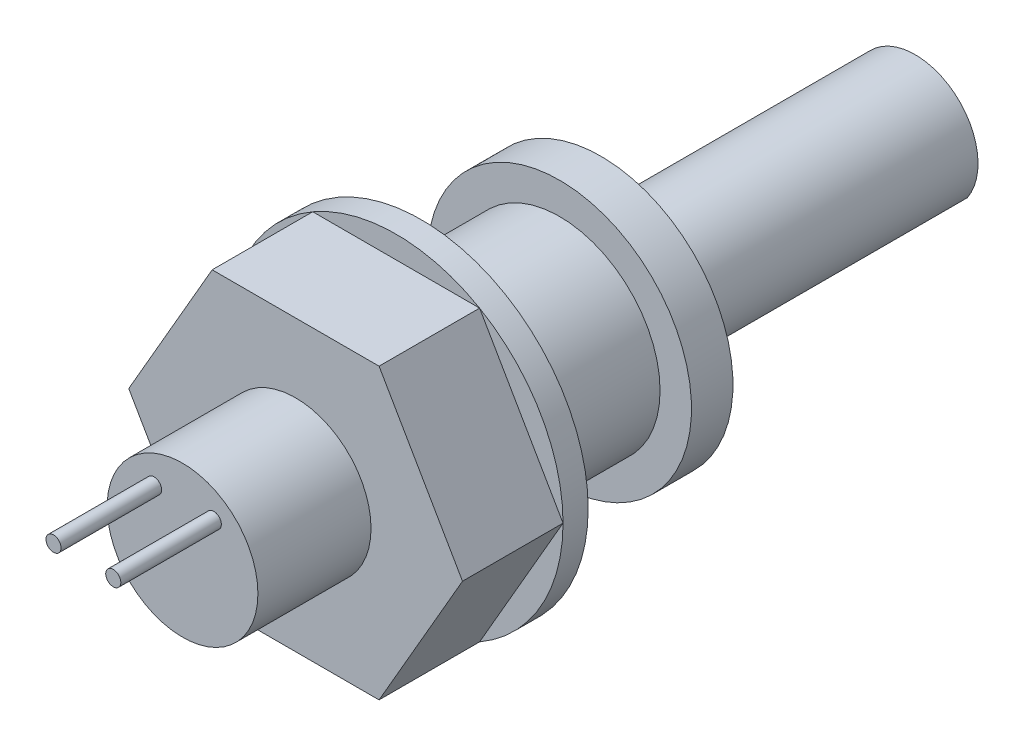
ISO-10303-21;
HEADER;
FILE_DESCRIPTION(('STEP AP214'),'2;1');
FILE_NAME('part.step','',(''),(''),'','','');
FILE_SCHEMA(('AUTOMOTIVE_DESIGN { 1 0 10303 214 1 1 1 1 }'));
ENDSEC;
DATA;
#1=APPLICATION_CONTEXT('core data for automotive mechanical design processes');
#2=APPLICATION_PROTOCOL_DEFINITION('international standard','automotive_design',2000,#1);
#3=PRODUCT_CONTEXT('',#1,'mechanical');
#4=PRODUCT('Part','Part','',(#3));
#5=PRODUCT_RELATED_PRODUCT_CATEGORY('part','',(#4));
#6=PRODUCT_DEFINITION_FORMATION('','',#4);
#7=PRODUCT_DEFINITION_CONTEXT('part definition',#1,'design');
#8=PRODUCT_DEFINITION('design','',#6,#7);
#9=PRODUCT_DEFINITION_SHAPE('','',#8);
#10=(LENGTH_UNIT() NAMED_UNIT(*) SI_UNIT(.MILLI.,.METRE.));
#11=(NAMED_UNIT(*) PLANE_ANGLE_UNIT() SI_UNIT($,.RADIAN.));
#12=(NAMED_UNIT(*) SI_UNIT($,.STERADIAN.) SOLID_ANGLE_UNIT());
#13=UNCERTAINTY_MEASURE_WITH_UNIT(LENGTH_MEASURE(1.E-05),#10,'distance_accuracy_value','');
#14=(GEOMETRIC_REPRESENTATION_CONTEXT(3) GLOBAL_UNCERTAINTY_ASSIGNED_CONTEXT((#13)) GLOBAL_UNIT_ASSIGNED_CONTEXT((#10,
#11,#12)) REPRESENTATION_CONTEXT('',''));
#15=CARTESIAN_POINT('',(0.,0.,0.));
#16=DIRECTION('',(0.,0.,1.));
#17=DIRECTION('',(1.,0.,0.));
#18=AXIS2_PLACEMENT_3D('',#15,#16,#17);
#19=CARTESIAN_POINT('',(0.,0.,-13.));
#20=DIRECTION('',(0.,0.,1.));
#21=DIRECTION('',(1.,0.,0.));
#22=AXIS2_PLACEMENT_3D('',#19,#20,#21);
#23=CYLINDRICAL_SURFACE('',#22,8.);
#24=CARTESIAN_POINT('',(0.,0.,-2.));
#25=DIRECTION('',(0.,0.,-1.));
#26=DIRECTION('',(-1.,0.,0.));
#27=AXIS2_PLACEMENT_3D('',#24,#25,#26);
#28=CIRCLE('',#27,8.);
#29=CARTESIAN_POINT('',(8.,0.,-2.));
#30=VERTEX_POINT('',#29);
#31=EDGE_CURVE('E42',#30,#30,#28,.T.);
#32=CARTESIAN_POINT('',(0.,0.,-13.));
#33=DIRECTION('',(0.,0.,-1.));
#34=DIRECTION('',(-1.,0.,0.));
#35=AXIS2_PLACEMENT_3D('',#32,#33,#34);
#36=CIRCLE('',#35,8.);
#37=CARTESIAN_POINT('',(8.,0.,-13.));
#38=VERTEX_POINT('',#37);
#39=EDGE_CURVE('E241',#38,#38,#36,.T.);
#40=CARTESIAN_POINT('',(8.,0.,-2.));
#41=CARTESIAN_POINT('',(8.,0.,-2.11458333333333));
#42=CARTESIAN_POINT('',(8.,0.,-2.22916666666667));
#43=CARTESIAN_POINT('',(8.,0.,-2.45833333333333));
#44=CARTESIAN_POINT('',(8.,0.,-2.57291666666667));
#45=CARTESIAN_POINT('',(8.,0.,-2.80208333333333));
#46=CARTESIAN_POINT('',(8.,0.,-2.91666666666667));
#47=CARTESIAN_POINT('',(8.,0.,-3.14583333333333));
#48=CARTESIAN_POINT('',(8.,0.,-3.26041666666666));
#49=CARTESIAN_POINT('',(8.,0.,-3.48958333333333));
#50=CARTESIAN_POINT('',(8.,0.,-3.60416666666666));
#51=CARTESIAN_POINT('',(8.,0.,-3.83333333333333));
#52=CARTESIAN_POINT('',(8.,0.,-3.94791666666666));
#53=CARTESIAN_POINT('',(8.,0.,-4.17708333333333));
#54=CARTESIAN_POINT('',(8.,0.,-4.29166666666667));
#55=CARTESIAN_POINT('',(8.,0.,-4.52083333333333));
#56=CARTESIAN_POINT('',(8.,0.,-4.63541666666667));
#57=CARTESIAN_POINT('',(8.,0.,-4.86458333333333));
#58=CARTESIAN_POINT('',(8.,0.,-4.97916666666666));
#59=CARTESIAN_POINT('',(8.,0.,-5.20833333333333));
#60=CARTESIAN_POINT('',(8.,0.,-5.32291666666666));
#61=CARTESIAN_POINT('',(8.,0.,-5.55208333333333));
#62=CARTESIAN_POINT('',(8.,0.,-5.66666666666666));
#63=CARTESIAN_POINT('',(8.,0.,-5.89583333333333));
#64=CARTESIAN_POINT('',(8.,0.,-6.01041666666666));
#65=CARTESIAN_POINT('',(8.,0.,-6.23958333333333));
#66=CARTESIAN_POINT('',(8.,0.,-6.35416666666666));
#67=CARTESIAN_POINT('',(8.,0.,-6.58333333333333));
#68=CARTESIAN_POINT('',(8.,0.,-6.69791666666666));
#69=CARTESIAN_POINT('',(8.,0.,-6.92708333333333));
#70=CARTESIAN_POINT('',(8.,0.,-7.04166666666667));
#71=CARTESIAN_POINT('',(8.,0.,-7.27083333333333));
#72=CARTESIAN_POINT('',(8.,0.,-7.38541666666666));
#73=CARTESIAN_POINT('',(8.,0.,-7.61458333333333));
#74=CARTESIAN_POINT('',(8.,0.,-7.72916666666666));
#75=CARTESIAN_POINT('',(8.,0.,-7.95833333333333));
#76=CARTESIAN_POINT('',(8.,0.,-8.07291666666666));
#77=CARTESIAN_POINT('',(8.,0.,-8.30208333333333));
#78=CARTESIAN_POINT('',(8.,0.,-8.41666666666666));
#79=CARTESIAN_POINT('',(8.,0.,-8.64583333333333));
#80=CARTESIAN_POINT('',(8.,0.,-8.76041666666666));
#81=CARTESIAN_POINT('',(8.,0.,-8.98958333333333));
#82=CARTESIAN_POINT('',(8.,0.,-9.10416666666666));
#83=CARTESIAN_POINT('',(8.,0.,-9.33333333333333));
#84=CARTESIAN_POINT('',(8.,0.,-9.44791666666667));
#85=CARTESIAN_POINT('',(8.,0.,-9.67708333333333));
#86=CARTESIAN_POINT('',(8.,0.,-9.79166666666666));
#87=CARTESIAN_POINT('',(8.,0.,-10.0208333333333));
#88=CARTESIAN_POINT('',(8.,0.,-10.1354166666667));
#89=CARTESIAN_POINT('',(8.,0.,-10.3645833333333));
#90=CARTESIAN_POINT('',(8.,0.,-10.4791666666667));
#91=CARTESIAN_POINT('',(8.,0.,-10.7083333333333));
#92=CARTESIAN_POINT('',(8.,0.,-10.8229166666667));
#93=CARTESIAN_POINT('',(8.,0.,-11.0520833333333));
#94=CARTESIAN_POINT('',(8.,0.,-11.1666666666667));
#95=CARTESIAN_POINT('',(8.,0.,-11.3958333333333));
#96=CARTESIAN_POINT('',(8.,0.,-11.5104166666667));
#97=CARTESIAN_POINT('',(8.,0.,-11.7395833333333));
#98=CARTESIAN_POINT('',(8.,0.,-11.8541666666667));
#99=CARTESIAN_POINT('',(8.,0.,-12.0833333333333));
#100=CARTESIAN_POINT('',(8.,0.,-12.1979166666667));
#101=CARTESIAN_POINT('',(8.,0.,-12.4270833333333));
#102=CARTESIAN_POINT('',(8.,0.,-12.5416666666667));
#103=CARTESIAN_POINT('',(8.,0.,-12.7708333333333));
#104=CARTESIAN_POINT('',(8.,0.,-12.8854166666667));
#105=CARTESIAN_POINT('',(8.,0.,-13.));
#106=B_SPLINE_CURVE_WITH_KNOTS('',3,(#40,#41,#42,#43,#44,#45,#46,#47,#48,#49,#50,#51,#52,#53,
#54,#55,#56,#57,#58,#59,#60,#61,#62,#63,#64,#65,#66,#67,#68,#69,#70,#71,#72,#73,#74,#75,#76,#77,
#78,#79,#80,#81,#82,#83,#84,#85,#86,#87,#88,#89,#90,#91,#92,#93,#94,#95,#96,#97,#98,#99,#100,
#101,#102,#103,#104,#105),.UNSPECIFIED.,.F.,.F.,(4,2,2,2,2,2,2,2,2,2,2,2,2,2,2,2,2,2,2,2,2,2,2,
2,2,2,2,2,2,2,2,2,4),(0.,0.34375,0.687500000000001,1.03125,1.375,1.71875,2.0625,2.40625,2.75,
3.09375,3.4375,3.78125,4.125,4.46875,4.8125,5.15625,5.5,5.84375,6.1875,6.53125,6.875,7.21875,
7.5625,7.90625,8.25,8.59375,8.9375,9.28125,9.625,9.96875,10.3125,10.65625,11.),.UNSPECIFIED.);
#107=EDGE_CURVE('BSEAM38',#30,#38,#106,.T.);
#108=ORIENTED_EDGE('',*,*,#31,.T.);
#109=ORIENTED_EDGE('',*,*,#39,.F.);
#110=ORIENTED_EDGE('',*,*,#107,.T.);
#111=ORIENTED_EDGE('',*,*,#107,.F.);
#112=EDGE_LOOP('',(#108,#110,#109,#111));
#113=FACE_BOUND('',#112,.T.);
#114=ADVANCED_FACE('F38',(#113),#23,.T.);
#115=CARTESIAN_POINT('',(0.,0.,-16.3));
#116=DIRECTION('',(0.,0.,1.));
#117=DIRECTION('',(1.,0.,0.));
#118=AXIS2_PLACEMENT_3D('',#115,#116,#117);
#119=CYLINDRICAL_SURFACE('',#118,10.5);
#120=CARTESIAN_POINT('',(0.,0.,-16.3));
#121=DIRECTION('',(0.,0.,-1.));
#122=DIRECTION('',(-1.,0.,0.));
#123=AXIS2_PLACEMENT_3D('',#120,#121,#122);
#124=CIRCLE('',#123,10.5);
#125=CARTESIAN_POINT('',(-10.5,0.,-16.3));
#126=VERTEX_POINT('',#125);
#127=EDGE_CURVE('E238',#126,#126,#124,.T.);
#128=ORIENTED_EDGE('',*,*,#127,.F.);
#129=EDGE_LOOP('',(#128));
#130=FACE_BOUND('',#129,.T.);
#131=CARTESIAN_POINT('',(0.,0.,-13.));
#132=DIRECTION('',(0.,0.,-1.));
#133=DIRECTION('',(-1.,0.,0.));
#134=AXIS2_PLACEMENT_3D('',#131,#132,#133);
#135=CIRCLE('',#134,10.5);
#136=CARTESIAN_POINT('',(-10.5,0.,-13.));
#137=VERTEX_POINT('',#136);
#138=EDGE_CURVE('E237',#137,#137,#135,.T.);
#139=ORIENTED_EDGE('',*,*,#138,.T.);
#140=EDGE_LOOP('',(#139));
#141=FACE_BOUND('',#140,.T.);
#142=ADVANCED_FACE('F298',(#130,#141),#119,.T.);
#143=CARTESIAN_POINT('',(0.,0.,-16.3));
#144=DIRECTION('',(0.,0.,-1.));
#145=DIRECTION('',(-1.,0.,0.));
#146=AXIS2_PLACEMENT_3D('',#143,#144,#145);
#147=PLANE('',#146);
#148=CARTESIAN_POINT('',(0.,0.,-16.3));
#149=DIRECTION('',(0.,0.,-1.));
#150=DIRECTION('',(-1.,0.,0.));
#151=AXIS2_PLACEMENT_3D('',#148,#149,#150);
#152=CIRCLE('',#151,5.);
#153=CARTESIAN_POINT('',(-4.1480961905584,-2.79164789933739,-16.3));
#154=VERTEX_POINT('',#153);
#155=CARTESIAN_POINT('',(4.1480961905584,-2.79164789933739,-16.3));
#156=VERTEX_POINT('',#155);
#157=EDGE_CURVE('E226',#154,#156,#152,.T.);
#158=ORIENTED_EDGE('',*,*,#157,.F.);
#159=DIRECTION('',(-1.,0.,0.));
#160=VECTOR('',#159,1.);
#161=CARTESIAN_POINT('',(4.1480961905584,-2.79164789933739,-16.3));
#162=LINE('',#161,#160);
#163=EDGE_CURVE('E55',#156,#154,#162,.T.);
#164=ORIENTED_EDGE('',*,*,#163,.F.);
#165=EDGE_LOOP('',(#158,#164));
#166=FACE_BOUND('',#165,.T.);
#167=ORIENTED_EDGE('',*,*,#127,.T.);
#168=EDGE_LOOP('',(#167));
#169=FACE_BOUND('',#168,.T.);
#170=ADVANCED_FACE('F304',(#166,#169),#147,.T.);
#171=CARTESIAN_POINT('',(0.,0.,-13.));
#172=DIRECTION('',(0.,0.,-1.));
#173=DIRECTION('',(-1.,0.,0.));
#174=AXIS2_PLACEMENT_3D('',#171,#172,#173);
#175=PLANE('',#174);
#176=ORIENTED_EDGE('',*,*,#39,.T.);
#177=EDGE_LOOP('',(#176));
#178=FACE_BOUND('',#177,.T.);
#179=ORIENTED_EDGE('',*,*,#138,.F.);
#180=EDGE_LOOP('',(#179));
#181=FACE_BOUND('',#180,.T.);
#182=ADVANCED_FACE('F310',(#178,#181),#175,.F.);
#183=CARTESIAN_POINT('',(0.,0.,-41.3));
#184=DIRECTION('',(0.,0.,1.));
#185=DIRECTION('',(1.,0.,0.));
#186=AXIS2_PLACEMENT_3D('',#183,#184,#185);
#187=CYLINDRICAL_SURFACE('',#186,5.);
#188=ORIENTED_EDGE('',*,*,#157,.T.);
#189=DIRECTION('',(0.,0.,1.));
#190=VECTOR('',#189,1.);
#191=CARTESIAN_POINT('',(4.1480961905584,-2.79164789933739,-41.3));
#192=LINE('',#191,#190);
#193=CARTESIAN_POINT('',(4.1480961905584,-2.79164789933739,-41.3));
#194=VERTEX_POINT('',#193);
#195=EDGE_CURVE('E234',#194,#156,#192,.T.);
#196=ORIENTED_EDGE('',*,*,#195,.F.);
#197=CARTESIAN_POINT('',(0.,0.,-41.3));
#198=DIRECTION('',(0.,0.,-1.));
#199=DIRECTION('',(-1.,0.,0.));
#200=AXIS2_PLACEMENT_3D('',#197,#198,#199);
#201=CIRCLE('',#200,5.);
#202=CARTESIAN_POINT('',(-4.1480961905584,-2.79164789933739,-41.3));
#203=VERTEX_POINT('',#202);
#204=EDGE_CURVE('E220',#203,#194,#201,.T.);
#205=ORIENTED_EDGE('',*,*,#204,.F.);
#206=DIRECTION('',(0.,0.,1.));
#207=VECTOR('',#206,1.);
#208=CARTESIAN_POINT('',(-4.1480961905584,-2.79164789933739,-41.3));
#209=LINE('',#208,#207);
#210=EDGE_CURVE('E225',#203,#154,#209,.T.);
#211=ORIENTED_EDGE('',*,*,#210,.T.);
#212=EDGE_LOOP('',(#188,#196,#205,#211));
#213=FACE_BOUND('',#212,.T.);
#214=ADVANCED_FACE('F313',(#213),#187,.T.);
#215=CARTESIAN_POINT('',(4.1480961905584,-2.79164789933739,-41.3));
#216=DIRECTION('',(0.,1.,0.));
#217=DIRECTION('',(-1.,0.,0.));
#218=AXIS2_PLACEMENT_3D('',#215,#216,#217);
#219=PLANE('',#218);
#220=ORIENTED_EDGE('',*,*,#163,.T.);
#221=ORIENTED_EDGE('',*,*,#210,.F.);
#222=DIRECTION('',(-1.,0.,0.));
#223=VECTOR('',#222,1.);
#224=CARTESIAN_POINT('',(4.1480961905584,-2.79164789933739,-41.3));
#225=LINE('',#224,#223);
#226=EDGE_CURVE('E88',#194,#203,#225,.T.);
#227=ORIENTED_EDGE('',*,*,#226,.F.);
#228=ORIENTED_EDGE('',*,*,#195,.T.);
#229=EDGE_LOOP('',(#220,#221,#227,#228));
#230=FACE_BOUND('',#229,.T.);
#231=ADVANCED_FACE('F319',(#230),#219,.F.);
#232=CARTESIAN_POINT('',(0.,0.,-41.3));
#233=DIRECTION('',(0.,0.,-1.));
#234=DIRECTION('',(-1.,0.,0.));
#235=AXIS2_PLACEMENT_3D('',#232,#233,#234);
#236=PLANE('',#235);
#237=ORIENTED_EDGE('',*,*,#204,.T.);
#238=ORIENTED_EDGE('',*,*,#226,.T.);
#239=EDGE_LOOP('',(#237,#238));
#240=FACE_BOUND('',#239,.T.);
#241=ADVANCED_FACE('F323',(#240),#236,.T.);
#242=CARTESIAN_POINT('',(0.,0.,0.));
#243=DIRECTION('',(0.,0.,-1.));
#244=DIRECTION('',(-1.,0.,0.));
#245=AXIS2_PLACEMENT_3D('',#242,#243,#244);
#246=PLANE('',#245);
#247=CARTESIAN_POINT('',(0.,0.,0.));
#248=DIRECTION('',(0.,0.,-1.));
#249=DIRECTION('',(-1.,0.,0.));
#250=AXIS2_PLACEMENT_3D('',#247,#248,#249);
#251=CIRCLE('',#250,13.2790561913614);
#252=CARTESIAN_POINT('',(6.63952809568069,-11.5,0.));
#253=VERTEX_POINT('',#252);
#254=CARTESIAN_POINT('',(-6.6395280956807,-11.5,0.));
#255=VERTEX_POINT('',#254);
#256=EDGE_CURVE('E77',#253,#255,#251,.T.);
#257=ORIENTED_EDGE('',*,*,#256,.F.);
#258=DIRECTION('',(1.,0.,0.));
#259=VECTOR('',#258,1.);
#260=CARTESIAN_POINT('',(-6.6395280956807,-11.5,0.));
#261=LINE('',#260,#259);
#262=EDGE_CURVE('E139',#255,#253,#261,.T.);
#263=ORIENTED_EDGE('',*,*,#262,.F.);
#264=EDGE_LOOP('',(#257,#263));
#265=FACE_BOUND('',#264,.T.);
#266=ADVANCED_FACE('F187',(#265),#246,.F.);
#267=CARTESIAN_POINT('',(13.2790561913614,0.,0.));
#268=VERTEX_POINT('',#267);
#269=EDGE_CURVE('E558',#268,#253,#251,.T.);
#270=ORIENTED_EDGE('',*,*,#269,.F.);
#271=DIRECTION('',(0.5,0.866025403784439,0.));
#272=VECTOR('',#271,1.);
#273=CARTESIAN_POINT('',(6.63952809568069,-11.5,0.));
#274=LINE('',#273,#272);
#275=EDGE_CURVE('E143',#253,#268,#274,.T.);
#276=ORIENTED_EDGE('',*,*,#275,.F.);
#277=EDGE_LOOP('',(#270,#276));
#278=FACE_BOUND('',#277,.T.);
#279=ADVANCED_FACE('F434',(#278),#246,.F.);
#280=CARTESIAN_POINT('',(6.6395280956807,11.5,0.));
#281=VERTEX_POINT('',#280);
#282=EDGE_CURVE('E217',#281,#268,#251,.T.);
#283=ORIENTED_EDGE('',*,*,#282,.F.);
#284=DIRECTION('',(-0.5,0.866025403784439,0.));
#285=VECTOR('',#284,1.);
#286=CARTESIAN_POINT('',(13.2790561913614,0.,0.));
#287=LINE('',#286,#285);
#288=EDGE_CURVE('E148',#268,#281,#287,.T.);
#289=ORIENTED_EDGE('',*,*,#288,.F.);
#290=EDGE_LOOP('',(#283,#289));
#291=FACE_BOUND('',#290,.T.);
#292=ADVANCED_FACE('F426',(#291),#246,.F.);
#293=CARTESIAN_POINT('',(-6.6395280956807,11.5,0.));
#294=VERTEX_POINT('',#293);
#295=EDGE_CURVE('E210',#294,#281,#251,.T.);
#296=ORIENTED_EDGE('',*,*,#295,.F.);
#297=DIRECTION('',(-1.,0.,0.));
#298=VECTOR('',#297,1.);
#299=CARTESIAN_POINT('',(6.6395280956807,11.5,0.));
#300=LINE('',#299,#298);
#301=EDGE_CURVE('E121',#281,#294,#300,.T.);
#302=ORIENTED_EDGE('',*,*,#301,.F.);
#303=EDGE_LOOP('',(#296,#302));
#304=FACE_BOUND('',#303,.T.);
#305=ADVANCED_FACE('F419',(#304),#246,.F.);
#306=CARTESIAN_POINT('',(-13.2790561913614,0.,0.));
#307=VERTEX_POINT('',#306);
#308=EDGE_CURVE('E200',#307,#294,#251,.T.);
#309=ORIENTED_EDGE('',*,*,#308,.F.);
#310=DIRECTION('',(-0.5,-0.866025403784439,0.));
#311=VECTOR('',#310,1.);
#312=CARTESIAN_POINT('',(-6.6395280956807,11.5,0.));
#313=LINE('',#312,#311);
#314=EDGE_CURVE('E154',#294,#307,#313,.T.);
#315=ORIENTED_EDGE('',*,*,#314,.F.);
#316=EDGE_LOOP('',(#309,#315));
#317=FACE_BOUND('',#316,.T.);
#318=ADVANCED_FACE('F206',(#317),#246,.F.);
#319=CARTESIAN_POINT('',(0.,0.,-2.));
#320=DIRECTION('',(0.,0.,1.));
#321=DIRECTION('',(1.,0.,0.));
#322=AXIS2_PLACEMENT_3D('',#319,#320,#321);
#323=CYLINDRICAL_SURFACE('',#322,13.2790561913614);
#324=CARTESIAN_POINT('',(0.,0.,-2.));
#325=DIRECTION('',(0.,0.,-1.));
#326=DIRECTION('',(-1.,0.,0.));
#327=AXIS2_PLACEMENT_3D('',#324,#325,#326);
#328=CIRCLE('',#327,13.2790561913614);
#329=CARTESIAN_POINT('',(-13.2790561913614,0.,-2.));
#330=VERTEX_POINT('',#329);
#331=EDGE_CURVE('E209',#330,#330,#328,.T.);
#332=ORIENTED_EDGE('',*,*,#331,.F.);
#333=EDGE_LOOP('',(#332));
#334=FACE_BOUND('',#333,.T.);
#335=ORIENTED_EDGE('',*,*,#308,.T.);
#336=ORIENTED_EDGE('',*,*,#295,.T.);
#337=ORIENTED_EDGE('',*,*,#282,.T.);
#338=ORIENTED_EDGE('',*,*,#269,.T.);
#339=ORIENTED_EDGE('',*,*,#256,.T.);
#340=EDGE_CURVE('E194',#255,#307,#251,.T.);
#341=ORIENTED_EDGE('',*,*,#340,.T.);
#342=EDGE_LOOP('',(#335,#336,#337,#338,#339,#341));
#343=FACE_BOUND('',#342,.T.);
#344=ADVANCED_FACE('F198',(#334,#343),#323,.T.);
#345=CARTESIAN_POINT('',(0.,0.,-2.));
#346=DIRECTION('',(0.,0.,-1.));
#347=DIRECTION('',(-1.,0.,0.));
#348=AXIS2_PLACEMENT_3D('',#345,#346,#347);
#349=PLANE('',#348);
#350=ORIENTED_EDGE('',*,*,#31,.F.);
#351=EDGE_LOOP('',(#350));
#352=FACE_BOUND('',#351,.T.);
#353=ORIENTED_EDGE('',*,*,#331,.T.);
#354=EDGE_LOOP('',(#353));
#355=FACE_BOUND('',#354,.T.);
#356=ADVANCED_FACE('F329',(#352,#355),#349,.T.);
#357=ORIENTED_EDGE('',*,*,#340,.F.);
#358=DIRECTION('',(0.5,-0.866025403784439,0.));
#359=VECTOR('',#358,1.);
#360=CARTESIAN_POINT('',(-13.2790561913614,0.,0.));
#361=LINE('',#360,#359);
#362=EDGE_CURVE('E157',#307,#255,#361,.T.);
#363=ORIENTED_EDGE('',*,*,#362,.F.);
#364=EDGE_LOOP('',(#357,#363));
#365=FACE_BOUND('',#364,.T.);
#366=ADVANCED_FACE('F193',(#365),#246,.F.);
#367=CARTESIAN_POINT('',(0.,0.,17.));
#368=DIRECTION('',(0.,0.,1.));
#369=DIRECTION('',(1.,0.,0.));
#370=AXIS2_PLACEMENT_3D('',#367,#368,#369);
#371=PLANE('',#370);
#372=CARTESIAN_POINT('',(2.49018716204631,3.32024954939522,17.));
#373=DIRECTION('',(0.,0.,1.));
#374=DIRECTION('',(1.,0.,0.));
#375=AXIS2_PLACEMENT_3D('',#372,#373,#374);
#376=CIRCLE('',#375,0.6);
#377=CARTESIAN_POINT('',(3.09018716204631,3.32024954939522,17.));
#378=VERTEX_POINT('',#377);
#379=EDGE_CURVE('E257',#378,#378,#376,.T.);
#380=ORIENTED_EDGE('',*,*,#379,.F.);
#381=EDGE_LOOP('',(#380));
#382=FACE_BOUND('',#381,.T.);
#383=CARTESIAN_POINT('',(-2.26380651095119,3.32024954939522,17.));
#384=DIRECTION('',(0.,0.,1.));
#385=DIRECTION('',(1.,0.,0.));
#386=AXIS2_PLACEMENT_3D('',#383,#384,#385);
#387=CIRCLE('',#386,0.6);
#388=CARTESIAN_POINT('',(-1.66380651095119,3.32024954939522,17.));
#389=VERTEX_POINT('',#388);
#390=EDGE_CURVE('E256',#389,#389,#387,.T.);
#391=ORIENTED_EDGE('',*,*,#390,.F.);
#392=EDGE_LOOP('',(#391));
#393=FACE_BOUND('',#392,.T.);
#394=CARTESIAN_POINT('',(0.,0.,17.));
#395=DIRECTION('',(0.,0.,1.));
#396=DIRECTION('',(1.,0.,0.));
#397=AXIS2_PLACEMENT_3D('',#394,#395,#396);
#398=CIRCLE('',#397,6.);
#399=CARTESIAN_POINT('',(6.,0.,17.));
#400=VERTEX_POINT('',#399);
#401=EDGE_CURVE('E144',#400,#400,#398,.T.);
#402=ORIENTED_EDGE('',*,*,#401,.T.);
#403=EDGE_LOOP('',(#402));
#404=FACE_BOUND('',#403,.T.);
#405=ADVANCED_FACE('F278',(#382,#393,#404),#371,.T.);
#406=CARTESIAN_POINT('',(0.,0.,17.));
#407=DIRECTION('',(0.,0.,-1.));
#408=DIRECTION('',(-1.,0.,0.));
#409=AXIS2_PLACEMENT_3D('',#406,#407,#408);
#410=CYLINDRICAL_SURFACE('',#409,6.);
#411=ORIENTED_EDGE('',*,*,#401,.F.);
#412=EDGE_LOOP('',(#411));
#413=FACE_BOUND('',#412,.T.);
#414=CARTESIAN_POINT('',(0.,0.,8.));
#415=DIRECTION('',(0.,0.,1.));
#416=DIRECTION('',(1.,0.,0.));
#417=AXIS2_PLACEMENT_3D('',#414,#415,#416);
#418=CIRCLE('',#417,6.);
#419=CARTESIAN_POINT('',(6.,0.,8.));
#420=VERTEX_POINT('',#419);
#421=EDGE_CURVE('E11',#420,#420,#418,.T.);
#422=ORIENTED_EDGE('',*,*,#421,.T.);
#423=EDGE_LOOP('',(#422));
#424=FACE_BOUND('',#423,.T.);
#425=ADVANCED_FACE('F281',(#413,#424),#410,.T.);
#426=CARTESIAN_POINT('',(0.,0.,8.));
#427=DIRECTION('',(0.,0.,1.));
#428=DIRECTION('',(1.,0.,0.));
#429=AXIS2_PLACEMENT_3D('',#426,#427,#428);
#430=PLANE('',#429);
#431=ORIENTED_EDGE('',*,*,#421,.F.);
#432=EDGE_LOOP('',(#431));
#433=FACE_BOUND('',#432,.T.);
#434=DIRECTION('',(1.,0.,0.));
#435=VECTOR('',#434,1.);
#436=CARTESIAN_POINT('',(-6.6395280956807,-11.5,8.));
#437=LINE('',#436,#435);
#438=CARTESIAN_POINT('',(-6.6395280956807,-11.5,8.));
#439=VERTEX_POINT('',#438);
#440=CARTESIAN_POINT('',(6.63952809568069,-11.5,8.));
#441=VERTEX_POINT('',#440);
#442=EDGE_CURVE('E161',#439,#441,#437,.T.);
#443=ORIENTED_EDGE('',*,*,#442,.T.);
#444=DIRECTION('',(0.5,0.866025403784439,0.));
#445=VECTOR('',#444,1.);
#446=CARTESIAN_POINT('',(6.63952809568069,-11.5,8.));
#447=LINE('',#446,#445);
#448=CARTESIAN_POINT('',(13.2790561913614,0.,8.));
#449=VERTEX_POINT('',#448);
#450=EDGE_CURVE('E182',#441,#449,#447,.T.);
#451=ORIENTED_EDGE('',*,*,#450,.T.);
#452=DIRECTION('',(-0.5,0.866025403784439,0.));
#453=VECTOR('',#452,1.);
#454=CARTESIAN_POINT('',(13.2790561913614,0.,8.));
#455=LINE('',#454,#453);
#456=CARTESIAN_POINT('',(6.6395280956807,11.5,8.));
#457=VERTEX_POINT('',#456);
#458=EDGE_CURVE('E109',#449,#457,#455,.T.);
#459=ORIENTED_EDGE('',*,*,#458,.T.);
#460=DIRECTION('',(-1.,0.,0.));
#461=VECTOR('',#460,1.);
#462=CARTESIAN_POINT('',(6.6395280956807,11.5,8.));
#463=LINE('',#462,#461);
#464=CARTESIAN_POINT('',(-6.6395280956807,11.5,8.));
#465=VERTEX_POINT('',#464);
#466=EDGE_CURVE('E102',#457,#465,#463,.T.);
#467=ORIENTED_EDGE('',*,*,#466,.T.);
#468=DIRECTION('',(-0.5,-0.866025403784439,0.));
#469=VECTOR('',#468,1.);
#470=CARTESIAN_POINT('',(-6.6395280956807,11.5,8.));
#471=LINE('',#470,#469);
#472=CARTESIAN_POINT('',(-13.2790561913614,0.,8.));
#473=VERTEX_POINT('',#472);
#474=EDGE_CURVE('E106',#465,#473,#471,.T.);
#475=ORIENTED_EDGE('',*,*,#474,.T.);
#476=DIRECTION('',(0.5,-0.866025403784439,0.));
#477=VECTOR('',#476,1.);
#478=CARTESIAN_POINT('',(-13.2790561913614,0.,8.));
#479=LINE('',#478,#477);
#480=EDGE_CURVE('E64',#473,#439,#479,.T.);
#481=ORIENTED_EDGE('',*,*,#480,.T.);
#482=EDGE_LOOP('',(#443,#451,#459,#467,#475,#481));
#483=FACE_BOUND('',#482,.T.);
#484=ADVANCED_FACE('F104',(#433,#483),#430,.T.);
#485=CARTESIAN_POINT('',(-13.2790561913614,0.,8.));
#486=DIRECTION('',(0.866025403784439,0.5,0.));
#487=DIRECTION('',(-0.5,0.866025403784439,0.));
#488=AXIS2_PLACEMENT_3D('',#485,#486,#487);
#489=PLANE('',#488);
#490=ORIENTED_EDGE('',*,*,#362,.T.);
#491=DIRECTION('',(0.,0.,-1.));
#492=VECTOR('',#491,1.);
#493=CARTESIAN_POINT('',(-6.6395280956807,-11.5,8.));
#494=LINE('',#493,#492);
#495=EDGE_CURVE('E135',#439,#255,#494,.T.);
#496=ORIENTED_EDGE('',*,*,#495,.F.);
#497=ORIENTED_EDGE('',*,*,#480,.F.);
#498=DIRECTION('',(0.,0.,-1.));
#499=VECTOR('',#498,1.);
#500=CARTESIAN_POINT('',(-13.2790561913614,0.,8.));
#501=LINE('',#500,#499);
#502=EDGE_CURVE('E126',#473,#307,#501,.T.);
#503=ORIENTED_EDGE('',*,*,#502,.T.);
#504=EDGE_LOOP('',(#490,#496,#497,#503));
#505=FACE_BOUND('',#504,.T.);
#506=ADVANCED_FACE('F190',(#505),#489,.F.);
#507=CARTESIAN_POINT('',(-6.6395280956807,11.5,8.));
#508=DIRECTION('',(0.866025403784438,-0.5,0.));
#509=DIRECTION('',(0.5,0.866025403784439,0.));
#510=AXIS2_PLACEMENT_3D('',#507,#508,#509);
#511=PLANE('',#510);
#512=ORIENTED_EDGE('',*,*,#314,.T.);
#513=ORIENTED_EDGE('',*,*,#502,.F.);
#514=ORIENTED_EDGE('',*,*,#474,.F.);
#515=DIRECTION('',(0.,0.,-1.));
#516=VECTOR('',#515,1.);
#517=CARTESIAN_POINT('',(-6.6395280956807,11.5,8.));
#518=LINE('',#517,#516);
#519=EDGE_CURVE('E117',#465,#294,#518,.T.);
#520=ORIENTED_EDGE('',*,*,#519,.T.);
#521=EDGE_LOOP('',(#512,#513,#514,#520));
#522=FACE_BOUND('',#521,.T.);
#523=ADVANCED_FACE('F128',(#522),#511,.F.);
#524=CARTESIAN_POINT('',(6.6395280956807,11.5,8.));
#525=DIRECTION('',(0.,-1.,0.));
#526=DIRECTION('',(1.,0.,0.));
#527=AXIS2_PLACEMENT_3D('',#524,#525,#526);
#528=PLANE('',#527);
#529=ORIENTED_EDGE('',*,*,#301,.T.);
#530=ORIENTED_EDGE('',*,*,#519,.F.);
#531=ORIENTED_EDGE('',*,*,#466,.F.);
#532=DIRECTION('',(0.,0.,-1.));
#533=VECTOR('',#532,1.);
#534=CARTESIAN_POINT('',(6.6395280956807,11.5,8.));
#535=LINE('',#534,#533);
#536=EDGE_CURVE('E125',#457,#281,#535,.T.);
#537=ORIENTED_EDGE('',*,*,#536,.T.);
#538=EDGE_LOOP('',(#529,#530,#531,#537));
#539=FACE_BOUND('',#538,.T.);
#540=ADVANCED_FACE('F118',(#539),#528,.F.);
#541=CARTESIAN_POINT('',(13.2790561913614,0.,8.));
#542=DIRECTION('',(-0.866025403784439,-0.5,0.));
#543=DIRECTION('',(0.5,-0.866025403784439,0.));
#544=AXIS2_PLACEMENT_3D('',#541,#542,#543);
#545=PLANE('',#544);
#546=ORIENTED_EDGE('',*,*,#288,.T.);
#547=ORIENTED_EDGE('',*,*,#536,.F.);
#548=ORIENTED_EDGE('',*,*,#458,.F.);
#549=DIRECTION('',(0.,0.,-1.));
#550=VECTOR('',#549,1.);
#551=CARTESIAN_POINT('',(13.2790561913614,0.,8.));
#552=LINE('',#551,#550);
#553=EDGE_CURVE('E169',#449,#268,#552,.T.);
#554=ORIENTED_EDGE('',*,*,#553,.T.);
#555=EDGE_LOOP('',(#546,#547,#548,#554));
#556=FACE_BOUND('',#555,.T.);
#557=ADVANCED_FACE('F364',(#556),#545,.F.);
#558=CARTESIAN_POINT('',(6.63952809568069,-11.5,8.));
#559=DIRECTION('',(-0.866025403784439,0.5,0.));
#560=DIRECTION('',(-0.5,-0.866025403784439,0.));
#561=AXIS2_PLACEMENT_3D('',#558,#559,#560);
#562=PLANE('',#561);
#563=ORIENTED_EDGE('',*,*,#275,.T.);
#564=ORIENTED_EDGE('',*,*,#553,.F.);
#565=ORIENTED_EDGE('',*,*,#450,.F.);
#566=DIRECTION('',(0.,0.,-1.));
#567=VECTOR('',#566,1.);
#568=CARTESIAN_POINT('',(6.63952809568069,-11.5,8.));
#569=LINE('',#568,#567);
#570=EDGE_CURVE('E48',#441,#253,#569,.T.);
#571=ORIENTED_EDGE('',*,*,#570,.T.);
#572=EDGE_LOOP('',(#563,#564,#565,#571));
#573=FACE_BOUND('',#572,.T.);
#574=ADVANCED_FACE('F178',(#573),#562,.F.);
#575=CARTESIAN_POINT('',(-6.6395280956807,-11.5,8.));
#576=DIRECTION('',(0.,1.,0.));
#577=DIRECTION('',(0.,0.,1.));
#578=AXIS2_PLACEMENT_3D('',#575,#576,#577);
#579=PLANE('',#578);
#580=ORIENTED_EDGE('',*,*,#262,.T.);
#581=ORIENTED_EDGE('',*,*,#570,.F.);
#582=ORIENTED_EDGE('',*,*,#442,.F.);
#583=ORIENTED_EDGE('',*,*,#495,.T.);
#584=EDGE_LOOP('',(#580,#581,#582,#583));
#585=FACE_BOUND('',#584,.T.);
#586=ADVANCED_FACE('F40',(#585),#579,.F.);
#587=CARTESIAN_POINT('',(-2.26380651095119,3.32024954939522,25.));
#588=DIRECTION('',(0.,0.,-1.));
#589=DIRECTION('',(-1.,0.,0.));
#590=AXIS2_PLACEMENT_3D('',#587,#588,#589);
#591=CYLINDRICAL_SURFACE('',#590,0.6);
#592=CARTESIAN_POINT('',(-2.26380651095119,3.32024954939522,25.));
#593=DIRECTION('',(0.,0.,1.));
#594=DIRECTION('',(1.,0.,0.));
#595=AXIS2_PLACEMENT_3D('',#592,#593,#594);
#596=CIRCLE('',#595,0.6);
#597=CARTESIAN_POINT('',(-1.66380651095119,3.32024954939522,25.));
#598=VERTEX_POINT('',#597);
#599=EDGE_CURVE('E202',#598,#598,#596,.T.);
#600=ORIENTED_EDGE('',*,*,#599,.F.);
#601=EDGE_LOOP('',(#600));
#602=FACE_BOUND('',#601,.T.);
#603=ORIENTED_EDGE('',*,*,#390,.T.);
#604=EDGE_LOOP('',(#603));
#605=FACE_BOUND('',#604,.T.);
#606=ADVANCED_FACE('F272',(#602,#605),#591,.T.);
#607=CARTESIAN_POINT('',(-2.26380651095119,3.32024954939522,25.));
#608=DIRECTION('',(0.,0.,1.));
#609=DIRECTION('',(1.,0.,0.));
#610=AXIS2_PLACEMENT_3D('',#607,#608,#609);
#611=PLANE('',#610);
#612=ORIENTED_EDGE('',*,*,#599,.T.);
#613=EDGE_LOOP('',(#612));
#614=FACE_BOUND('',#613,.T.);
#615=ADVANCED_FACE('F270',(#614),#611,.T.);
#616=CARTESIAN_POINT('',(2.49018716204631,3.32024954939522,25.));
#617=DIRECTION('',(0.,0.,-1.));
#618=DIRECTION('',(-1.,0.,0.));
#619=AXIS2_PLACEMENT_3D('',#616,#617,#618);
#620=CYLINDRICAL_SURFACE('',#619,0.6);
#621=CARTESIAN_POINT('',(2.49018716204631,3.32024954939522,25.));
#622=DIRECTION('',(0.,0.,1.));
#623=DIRECTION('',(1.,0.,0.));
#624=AXIS2_PLACEMENT_3D('',#621,#622,#623);
#625=CIRCLE('',#624,0.6);
#626=CARTESIAN_POINT('',(3.09018716204631,3.32024954939522,25.));
#627=VERTEX_POINT('',#626);
#628=EDGE_CURVE('E254',#627,#627,#625,.T.);
#629=ORIENTED_EDGE('',*,*,#628,.F.);
#630=EDGE_LOOP('',(#629));
#631=FACE_BOUND('',#630,.T.);
#632=ORIENTED_EDGE('',*,*,#379,.T.);
#633=EDGE_LOOP('',(#632));
#634=FACE_BOUND('',#633,.T.);
#635=ADVANCED_FACE('F338',(#631,#634),#620,.T.);
#636=CARTESIAN_POINT('',(2.49018716204631,3.32024954939522,25.));
#637=DIRECTION('',(0.,0.,1.));
#638=DIRECTION('',(1.,0.,0.));
#639=AXIS2_PLACEMENT_3D('',#636,#637,#638);
#640=PLANE('',#639);
#641=ORIENTED_EDGE('',*,*,#628,.T.);
#642=EDGE_LOOP('',(#641));
#643=FACE_BOUND('',#642,.T.);
#644=ADVANCED_FACE('F341',(#643),#640,.T.);
#645=CLOSED_SHELL('',(#114,#142,#170,#182,#214,#231,#241,#266,#279,#292,#305,#318,#344,#356,
#366,#405,#425,#484,#506,#523,#540,#557,#574,#586,#606,#615,#635,#644));
#646=MANIFOLD_SOLID_BREP('B2',#645);
#647=ADVANCED_BREP_SHAPE_REPRESENTATION('',(#18,#646),#14);
#648=SHAPE_DEFINITION_REPRESENTATION(#9,#647);
ENDSEC;
END-ISO-10303-21;
